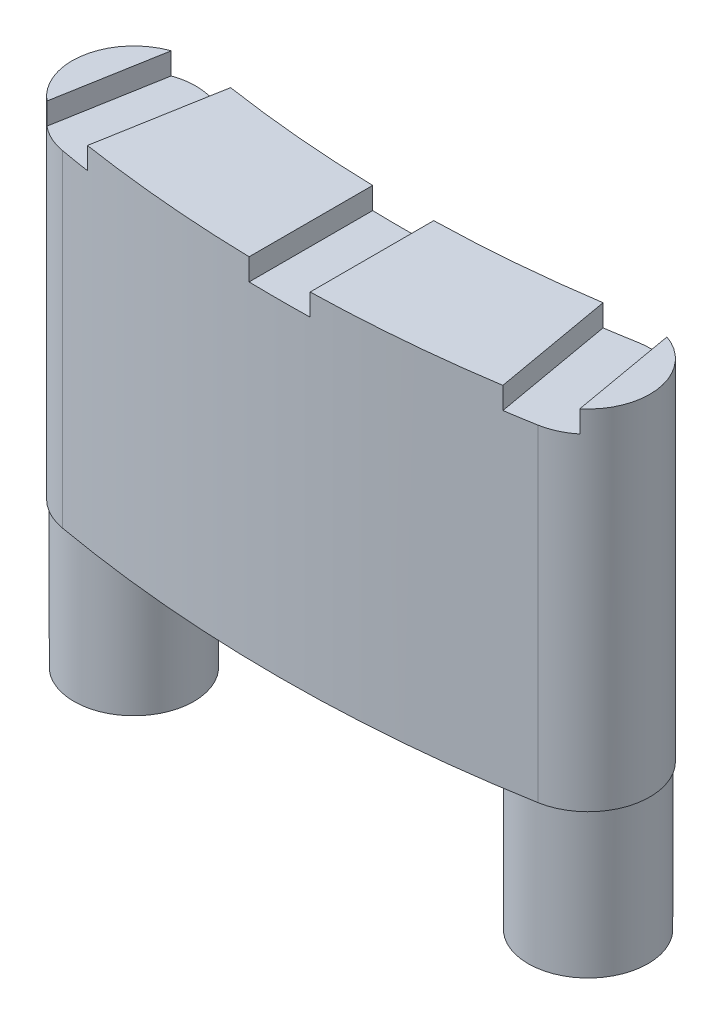
ISO-10303-21;
HEADER;
FILE_DESCRIPTION(('STEP AP214'),'2;1');
FILE_NAME('part.step','',(''),(''),'','','');
FILE_SCHEMA(('AUTOMOTIVE_DESIGN { 1 0 10303 214 1 1 1 1 }'));
ENDSEC;
DATA;
#1=APPLICATION_CONTEXT('core data for automotive mechanical design processes');
#2=APPLICATION_PROTOCOL_DEFINITION('international standard','automotive_design',2000,#1);
#3=PRODUCT_CONTEXT('',#1,'mechanical');
#4=PRODUCT('Part','Part','',(#3));
#5=PRODUCT_RELATED_PRODUCT_CATEGORY('part','',(#4));
#6=PRODUCT_DEFINITION_FORMATION('','',#4);
#7=PRODUCT_DEFINITION_CONTEXT('part definition',#1,'design');
#8=PRODUCT_DEFINITION('design','',#6,#7);
#9=PRODUCT_DEFINITION_SHAPE('','',#8);
#10=(LENGTH_UNIT() NAMED_UNIT(*) SI_UNIT(.MILLI.,.METRE.));
#11=(NAMED_UNIT(*) PLANE_ANGLE_UNIT() SI_UNIT($,.RADIAN.));
#12=(NAMED_UNIT(*) SI_UNIT($,.STERADIAN.) SOLID_ANGLE_UNIT());
#13=UNCERTAINTY_MEASURE_WITH_UNIT(LENGTH_MEASURE(1.E-05),#10,'distance_accuracy_value','');
#14=(GEOMETRIC_REPRESENTATION_CONTEXT(3) GLOBAL_UNCERTAINTY_ASSIGNED_CONTEXT((#13)) GLOBAL_UNIT_ASSIGNED_CONTEXT((#10,
#11,#12)) REPRESENTATION_CONTEXT('',''));
#15=CARTESIAN_POINT('',(0.,0.,0.));
#16=DIRECTION('',(0.,0.,1.));
#17=DIRECTION('',(1.,0.,0.));
#18=AXIS2_PLACEMENT_3D('',#15,#16,#17);
#19=CARTESIAN_POINT('',(-7.80892658931664,24.,-47.5042222803918));
#20=DIRECTION('',(0.,1.,0.));
#21=DIRECTION('',(0.,0.,1.));
#22=AXIS2_PLACEMENT_3D('',#19,#20,#21);
#23=PLANE('',#22);
#24=DIRECTION('',(-0.17364817766693,0.,-0.984807753012208));
#25=VECTOR('',#24,1.);
#26=CARTESIAN_POINT('',(9.41109191254966,24.,-50.5405761505698));
#27=LINE('',#26,#25);
#28=CARTESIAN_POINT('',(18.3386484929561,24.,0.0901131774980607));
#29=VERTEX_POINT('',#28);
#30=CARTESIAN_POINT('',(17.0543750947054,24.,-7.19336319741984));
#31=VERTEX_POINT('',#30);
#32=EDGE_CURVE('E258',#29,#31,#27,.T.);
#33=ORIENTED_EDGE('',*,*,#32,.F.);
#34=CARTESIAN_POINT('',(15.6335772894344,24.,-3.18787399740136));
#35=DIRECTION('',(0.,1.,0.));
#36=DIRECTION('',(0.,0.,-1.));
#37=AXIS2_PLACEMENT_3D('',#34,#35,#36);
#38=CIRCLE('',#37,4.25001295703056);
#39=EDGE_CURVE('E211',#29,#31,#38,.T.);
#40=ORIENTED_EDGE('',*,*,#39,.T.);
#41=EDGE_LOOP('',(#33,#40));
#42=FACE_BOUND('',#41,.T.);
#43=ADVANCED_FACE('F33',(#42),#23,.T.);
#44=DIRECTION('',(0.173648177666932,0.,-0.984807753012208));
#45=VECTOR('',#44,1.);
#46=CARTESIAN_POINT('',(-5.74599208495633,24.,-47.1404712678386));
#47=LINE('',#46,#45);
#48=CARTESIAN_POINT('',(-14.2941220515957,24.,1.33838280369231));
#49=VERTEX_POINT('',#48);
#50=CARTESIAN_POINT('',(-12.8177116848135,24.,-7.03475646773465));
#51=VERTEX_POINT('',#50);
#52=EDGE_CURVE('E272',#49,#51,#47,.T.);
#53=ORIENTED_EDGE('',*,*,#52,.F.);
#54=CARTESIAN_POINT('',(0.00524140569490179,24.,-91.8205711659412));
#55=DIRECTION('',(0.,1.,0.));
#56=DIRECTION('',(0.,0.,1.));
#57=AXIS2_PLACEMENT_3D('',#54,#55,#56);
#58=CIRCLE('',#57,94.25);
#59=CARTESIAN_POINT('',(-2.1,24.,2.40591374474483));
#60=VERTEX_POINT('',#59);
#61=EDGE_CURVE('E209',#49,#60,#58,.T.);
#62=ORIENTED_EDGE('',*,*,#61,.T.);
#63=DIRECTION('',(0.,0.,1.));
#64=VECTOR('',#63,1.);
#65=CARTESIAN_POINT('',(-2.09999999999996,24.,-47.5042222803918));
#66=LINE('',#65,#64);
#67=CARTESIAN_POINT('',(-2.1,24.,-6.09641786814687));
#68=VERTEX_POINT('',#67);
#69=EDGE_CURVE('E239',#68,#60,#66,.T.);
#70=ORIENTED_EDGE('',*,*,#69,.F.);
#71=CARTESIAN_POINT('',(0.00524140569490179,24.,-91.8205711659412));
#72=DIRECTION('',(0.,-1.,0.));
#73=DIRECTION('',(0.,0.,1.));
#74=AXIS2_PLACEMENT_3D('',#71,#72,#73);
#75=CIRCLE('',#74,85.75);
#76=EDGE_CURVE('E214',#68,#51,#75,.T.);
#77=ORIENTED_EDGE('',*,*,#76,.T.);
#78=EDGE_LOOP('',(#53,#62,#70,#77));
#79=FACE_BOUND('',#78,.T.);
#80=ADVANCED_FACE('F325',(#79),#23,.T.);
#81=DIRECTION('',(0.17364817766693,0.,0.984807753012208));
#82=VECTOR('',#81,1.);
#83=CARTESIAN_POINT('',(5.27489934989838,24.,-49.8112538043687));
#84=LINE('',#83,#82);
#85=CARTESIAN_POINT('',(12.8178263496068,24.,-7.03318904421842));
#86=VERTEX_POINT('',#85);
#87=CARTESIAN_POINT('',(14.2942407401054,24.,1.33997304683814));
#88=VERTEX_POINT('',#87);
#89=EDGE_CURVE('E161',#86,#88,#84,.T.);
#90=ORIENTED_EDGE('',*,*,#89,.F.);
#91=CARTESIAN_POINT('',(2.1,24.,-6.09616106921566));
#92=VERTEX_POINT('',#91);
#93=EDGE_CURVE('E215',#86,#92,#75,.T.);
#94=ORIENTED_EDGE('',*,*,#93,.T.);
#95=DIRECTION('',(0.,0.,-1.));
#96=VECTOR('',#95,1.);
#97=CARTESIAN_POINT('',(2.10000000000004,24.,-47.5042222803918));
#98=LINE('',#97,#96);
#99=CARTESIAN_POINT('',(2.1,24.,2.4061473720169));
#100=VERTEX_POINT('',#99);
#101=EDGE_CURVE('E171',#100,#92,#98,.T.);
#102=ORIENTED_EDGE('',*,*,#101,.F.);
#103=EDGE_CURVE('E207',#100,#88,#58,.T.);
#104=ORIENTED_EDGE('',*,*,#103,.T.);
#105=EDGE_LOOP('',(#90,#94,#102,#104));
#106=FACE_BOUND('',#105,.T.);
#107=ADVANCED_FACE('F306',(#106),#23,.T.);
#108=CARTESIAN_POINT('',(-15.6230945843282,24.,-3.18787339484238));
#109=DIRECTION('',(0.,-1.,0.));
#110=DIRECTION('',(0.,0.,-1.));
#111=AXIS2_PLACEMENT_3D('',#108,#109,#110);
#112=CYLINDRICAL_SURFACE('',#111,4.25);
#113=CARTESIAN_POINT('',(-15.6230945843282,24.,-3.18787339484238));
#114=DIRECTION('',(0.,1.,0.));
#115=DIRECTION('',(0.,0.,1.));
#116=AXIS2_PLACEMENT_3D('',#113,#114,#115);
#117=CIRCLE('',#116,4.25);
#118=CARTESIAN_POINT('',(-17.0552531039034,24.,-7.18930088697669));
#119=VERTEX_POINT('',#118);
#120=CARTESIAN_POINT('',(-18.3374521813357,24.,0.0824114299959114));
#121=VERTEX_POINT('',#120);
#122=EDGE_CURVE('E204',#119,#121,#117,.T.);
#123=ORIENTED_EDGE('',*,*,#122,.F.);
#124=DIRECTION('',(0.,-1.,0.));
#125=VECTOR('',#124,1.);
#126=CARTESIAN_POINT('',(-17.0552531039034,24.,-7.18930088697669));
#127=LINE('',#126,#125);
#128=CARTESIAN_POINT('',(-17.0552531039034,22.5,-7.18930088697669));
#129=VERTEX_POINT('',#128);
#130=EDGE_CURVE('E56',#119,#129,#127,.T.);
#131=ORIENTED_EDGE('',*,*,#130,.T.);
#132=CARTESIAN_POINT('',(-15.6230945843282,22.5,-3.18787339484238));
#133=DIRECTION('',(0.,1.,0.));
#134=DIRECTION('',(0.,0.,1.));
#135=AXIS2_PLACEMENT_3D('',#132,#133,#134);
#136=CIRCLE('',#135,4.25);
#137=CARTESIAN_POINT('',(-14.8850898292438,22.5,-7.37330634514428));
#138=VERTEX_POINT('',#137);
#139=EDGE_CURVE('E280',#138,#129,#136,.T.);
#140=ORIENTED_EDGE('',*,*,#139,.F.);
#141=DIRECTION('',(0.,-1.,0.));
#142=VECTOR('',#141,1.);
#143=CARTESIAN_POINT('',(-14.8850898292438,24.,-7.37330634514428));
#144=LINE('',#143,#142);
#145=CARTESIAN_POINT('',(-14.8850898292438,0.,-7.37330634514428));
#146=VERTEX_POINT('',#145);
#147=EDGE_CURVE('E217',#138,#146,#144,.T.);
#148=ORIENTED_EDGE('',*,*,#147,.T.);
#149=CARTESIAN_POINT('',(-15.6230945843282,0.,-3.18787339484238));
#150=DIRECTION('',(0.,1.,0.));
#151=DIRECTION('',(0.,0.,1.));
#152=AXIS2_PLACEMENT_3D('',#149,#150,#151);
#153=CIRCLE('',#152,4.25);
#154=CARTESIAN_POINT('',(-16.3610993394126,0.,0.997559555459479));
#155=VERTEX_POINT('',#154);
#156=EDGE_CURVE('E203',#146,#155,#153,.T.);
#157=ORIENTED_EDGE('',*,*,#156,.T.);
#158=DIRECTION('',(0.,-1.,0.));
#159=VECTOR('',#158,1.);
#160=CARTESIAN_POINT('',(-16.3610993394126,24.,0.997559555459479));
#161=LINE('',#160,#159);
#162=CARTESIAN_POINT('',(-16.3610993394126,22.5,0.997559555459493));
#163=VERTEX_POINT('',#162);
#164=EDGE_CURVE('E231',#163,#155,#161,.T.);
#165=ORIENTED_EDGE('',*,*,#164,.F.);
#166=CARTESIAN_POINT('',(-18.3374521813357,22.5,0.0824114299959114));
#167=VERTEX_POINT('',#166);
#168=EDGE_CURVE('E282',#167,#163,#136,.T.);
#169=ORIENTED_EDGE('',*,*,#168,.F.);
#170=DIRECTION('',(0.,-1.,0.));
#171=VECTOR('',#170,1.);
#172=CARTESIAN_POINT('',(-18.3374521813357,24.,0.0824114299959118));
#173=LINE('',#172,#171);
#174=EDGE_CURVE('E165',#167,#121,#173,.F.);
#175=ORIENTED_EDGE('',*,*,#174,.T.);
#176=EDGE_LOOP('',(#123,#131,#140,#148,#157,#165,#169,#175));
#177=FACE_BOUND('',#176,.T.);
#178=ADVANCED_FACE('F35',(#177),#112,.T.);
#179=CARTESIAN_POINT('',(0.00524140569490179,24.,-91.8205711659412));
#180=DIRECTION('',(0.,-1.,0.));
#181=DIRECTION('',(0.,0.,-1.));
#182=AXIS2_PLACEMENT_3D('',#179,#180,#181);
#183=CYLINDRICAL_SURFACE('',#182,94.25);
#184=CARTESIAN_POINT('',(0.00524140569490179,22.5,-91.8205711659412));
#185=DIRECTION('',(0.,1.,0.));
#186=DIRECTION('',(0.,0.,1.));
#187=AXIS2_PLACEMENT_3D('',#184,#185,#186);
#188=CIRCLE('',#187,94.25);
#189=CARTESIAN_POINT('',(14.2942407401054,22.5,1.33997304683814));
#190=VERTEX_POINT('',#189);
#191=CARTESIAN_POINT('',(16.3612584956571,22.5,0.999379302440653));
#192=VERTEX_POINT('',#191);
#193=EDGE_CURVE('E150',#190,#192,#188,.T.);
#194=ORIENTED_EDGE('',*,*,#193,.F.);
#195=DIRECTION('',(0.,1.,0.));
#196=VECTOR('',#195,1.);
#197=CARTESIAN_POINT('',(14.2942407401054,22.5,1.33997304683814));
#198=LINE('',#197,#196);
#199=EDGE_CURVE('E155',#190,#88,#198,.T.);
#200=ORIENTED_EDGE('',*,*,#199,.T.);
#201=ORIENTED_EDGE('',*,*,#103,.F.);
#202=DIRECTION('',(0.,1.,0.));
#203=VECTOR('',#202,1.);
#204=CARTESIAN_POINT('',(2.1,22.5,2.4061473720169));
#205=LINE('',#204,#203);
#206=CARTESIAN_POINT('',(2.1,22.5,2.4061473720169));
#207=VERTEX_POINT('',#206);
#208=EDGE_CURVE('E187',#207,#100,#205,.T.);
#209=ORIENTED_EDGE('',*,*,#208,.F.);
#210=CARTESIAN_POINT('',(0.00524140569490179,22.5,-91.8205711659412));
#211=DIRECTION('',(0.,1.,0.));
#212=DIRECTION('',(0.,0.,1.));
#213=AXIS2_PLACEMENT_3D('',#210,#211,#212);
#214=CIRCLE('',#213,94.25);
#215=CARTESIAN_POINT('',(-2.1,22.5,2.40591374474483));
#216=VERTEX_POINT('',#215);
#217=EDGE_CURVE('E195',#216,#207,#214,.T.);
#218=ORIENTED_EDGE('',*,*,#217,.F.);
#219=DIRECTION('',(0.,1.,0.));
#220=VECTOR('',#219,1.);
#221=CARTESIAN_POINT('',(-2.1,22.5,2.40591374474483));
#222=LINE('',#221,#220);
#223=EDGE_CURVE('E183',#216,#60,#222,.T.);
#224=ORIENTED_EDGE('',*,*,#223,.T.);
#225=ORIENTED_EDGE('',*,*,#61,.F.);
#226=DIRECTION('',(0.,1.,0.));
#227=VECTOR('',#226,1.);
#228=CARTESIAN_POINT('',(-14.2941220515957,22.5,1.33838280369231));
#229=LINE('',#228,#227);
#230=CARTESIAN_POINT('',(-14.2941220515957,22.5,1.33838280369231));
#231=VERTEX_POINT('',#230);
#232=EDGE_CURVE('E264',#231,#49,#229,.T.);
#233=ORIENTED_EDGE('',*,*,#232,.F.);
#234=CARTESIAN_POINT('',(0.00524140569490179,22.5,-91.8205711659412));
#235=DIRECTION('',(0.,1.,0.));
#236=DIRECTION('',(0.,0.,1.));
#237=AXIS2_PLACEMENT_3D('',#234,#235,#236);
#238=CIRCLE('',#237,94.25);
#239=EDGE_CURVE('E281',#163,#231,#238,.T.);
#240=ORIENTED_EDGE('',*,*,#239,.F.);
#241=ORIENTED_EDGE('',*,*,#164,.T.);
#242=CARTESIAN_POINT('',(0.00524140569490179,0.,-91.8205711659412));
#243=DIRECTION('',(0.,1.,0.));
#244=DIRECTION('',(0.,0.,1.));
#245=AXIS2_PLACEMENT_3D('',#242,#243,#244);
#246=CIRCLE('',#245,94.25);
#247=CARTESIAN_POINT('',(16.3612584956571,0.,0.999379302440653));
#248=VERTEX_POINT('',#247);
#249=EDGE_CURVE('E220',#155,#248,#246,.T.);
#250=ORIENTED_EDGE('',*,*,#249,.T.);
#251=DIRECTION('',(0.,-1.,0.));
#252=VECTOR('',#251,1.);
#253=CARTESIAN_POINT('',(16.3612584956571,24.,0.999379302440653));
#254=LINE('',#253,#252);
#255=EDGE_CURVE('E170',#192,#248,#254,.T.);
#256=ORIENTED_EDGE('',*,*,#255,.F.);
#257=EDGE_LOOP('',(#194,#200,#201,#209,#218,#224,#225,#233,#240,#241,#250,#256));
#258=FACE_BOUND('',#257,.T.);
#259=ADVANCED_FACE('F168',(#258),#183,.T.);
#260=CARTESIAN_POINT('',(15.6335772894344,24.,-3.18787399740136));
#261=DIRECTION('',(0.,-1.,0.));
#262=DIRECTION('',(0.,0.,-1.));
#263=AXIS2_PLACEMENT_3D('',#260,#261,#262);
#264=CYLINDRICAL_SURFACE('',#263,4.25001295703056);
#265=CARTESIAN_POINT('',(15.6335772894344,22.5,-3.18787399740136));
#266=DIRECTION('',(0.,1.,0.));
#267=DIRECTION('',(0.,0.,1.));
#268=AXIS2_PLACEMENT_3D('',#265,#266,#267);
#269=CIRCLE('',#268,4.25001295703056);
#270=CARTESIAN_POINT('',(17.0543750947054,22.5,-7.19336319741984));
#271=VERTEX_POINT('',#270);
#272=CARTESIAN_POINT('',(14.885248975457,22.5,-7.37148665507266));
#273=VERTEX_POINT('',#272);
#274=EDGE_CURVE('E48',#271,#273,#269,.T.);
#275=ORIENTED_EDGE('',*,*,#274,.F.);
#276=DIRECTION('',(0.,-1.,0.));
#277=VECTOR('',#276,1.);
#278=CARTESIAN_POINT('',(17.0543750947054,24.,-7.19336319741984));
#279=LINE('',#278,#277);
#280=EDGE_CURVE('E11',#271,#31,#279,.F.);
#281=ORIENTED_EDGE('',*,*,#280,.T.);
#282=ORIENTED_EDGE('',*,*,#39,.F.);
#283=DIRECTION('',(0.,-1.,0.));
#284=VECTOR('',#283,1.);
#285=CARTESIAN_POINT('',(18.3386484929561,24.,0.0901131774980633));
#286=LINE('',#285,#284);
#287=CARTESIAN_POINT('',(18.3386484929561,22.5,0.0901131774980607));
#288=VERTEX_POINT('',#287);
#289=EDGE_CURVE('E41',#29,#288,#286,.T.);
#290=ORIENTED_EDGE('',*,*,#289,.T.);
#291=EDGE_CURVE('E172',#192,#288,#269,.T.);
#292=ORIENTED_EDGE('',*,*,#291,.F.);
#293=ORIENTED_EDGE('',*,*,#255,.T.);
#294=CARTESIAN_POINT('',(15.6335772894344,0.,-3.18787399740136));
#295=DIRECTION('',(0.,1.,0.));
#296=DIRECTION('',(0.,0.,-1.));
#297=AXIS2_PLACEMENT_3D('',#294,#295,#296);
#298=CIRCLE('',#297,4.25001295703056);
#299=CARTESIAN_POINT('',(14.885248975457,0.,-7.37148665507266));
#300=VERTEX_POINT('',#299);
#301=EDGE_CURVE('E222',#248,#300,#298,.T.);
#302=ORIENTED_EDGE('',*,*,#301,.T.);
#303=DIRECTION('',(0.,-1.,0.));
#304=VECTOR('',#303,1.);
#305=CARTESIAN_POINT('',(14.885248975457,24.,-7.37148665507266));
#306=LINE('',#305,#304);
#307=EDGE_CURVE('E228',#273,#300,#306,.T.);
#308=ORIENTED_EDGE('',*,*,#307,.F.);
#309=EDGE_LOOP('',(#275,#281,#282,#290,#292,#293,#302,#308));
#310=FACE_BOUND('',#309,.T.);
#311=ADVANCED_FACE('F253',(#310),#264,.T.);
#312=CARTESIAN_POINT('',(0.00524140569490179,24.,-91.8205711659412));
#313=DIRECTION('',(0.,-1.,0.));
#314=DIRECTION('',(0.,0.,-1.));
#315=AXIS2_PLACEMENT_3D('',#312,#313,#314);
#316=CYLINDRICAL_SURFACE('',#315,85.75);
#317=ORIENTED_EDGE('',*,*,#93,.F.);
#318=DIRECTION('',(0.,-1.,0.));
#319=VECTOR('',#318,1.);
#320=CARTESIAN_POINT('',(12.8178263496068,24.,-7.03318904421843));
#321=LINE('',#320,#319);
#322=CARTESIAN_POINT('',(12.8178263496068,22.5,-7.03318904421842));
#323=VERTEX_POINT('',#322);
#324=EDGE_CURVE('E249',#86,#323,#321,.T.);
#325=ORIENTED_EDGE('',*,*,#324,.T.);
#326=CARTESIAN_POINT('',(0.00524140569490179,22.5,-91.8205711659412));
#327=DIRECTION('',(0.,1.,0.));
#328=DIRECTION('',(0.,0.,1.));
#329=AXIS2_PLACEMENT_3D('',#326,#327,#328);
#330=CIRCLE('',#329,85.75);
#331=EDGE_CURVE('E152',#273,#323,#330,.F.);
#332=ORIENTED_EDGE('',*,*,#331,.F.);
#333=ORIENTED_EDGE('',*,*,#307,.T.);
#334=CARTESIAN_POINT('',(0.00524140569490179,0.,-91.8205711659412));
#335=DIRECTION('',(0.,-1.,0.));
#336=DIRECTION('',(0.,0.,1.));
#337=AXIS2_PLACEMENT_3D('',#334,#335,#336);
#338=CIRCLE('',#337,85.75);
#339=EDGE_CURVE('E208',#300,#146,#338,.T.);
#340=ORIENTED_EDGE('',*,*,#339,.T.);
#341=ORIENTED_EDGE('',*,*,#147,.F.);
#342=CARTESIAN_POINT('',(0.00524140569490179,22.5,-91.8205711659412));
#343=DIRECTION('',(0.,1.,0.));
#344=DIRECTION('',(0.,0.,1.));
#345=AXIS2_PLACEMENT_3D('',#342,#343,#344);
#346=CIRCLE('',#345,85.75);
#347=CARTESIAN_POINT('',(-12.8177116848135,22.5,-7.03475646773465));
#348=VERTEX_POINT('',#347);
#349=EDGE_CURVE('E246',#348,#138,#346,.F.);
#350=ORIENTED_EDGE('',*,*,#349,.F.);
#351=DIRECTION('',(0.,1.,0.));
#352=VECTOR('',#351,1.);
#353=CARTESIAN_POINT('',(-12.8177116848135,22.5,-7.03475646773465));
#354=LINE('',#353,#352);
#355=EDGE_CURVE('E260',#348,#51,#354,.T.);
#356=ORIENTED_EDGE('',*,*,#355,.T.);
#357=ORIENTED_EDGE('',*,*,#76,.F.);
#358=DIRECTION('',(0.,-1.,0.));
#359=VECTOR('',#358,1.);
#360=CARTESIAN_POINT('',(-2.1,24.,-6.09641786814687));
#361=LINE('',#360,#359);
#362=CARTESIAN_POINT('',(-2.1,22.5,-6.09641786814687));
#363=VERTEX_POINT('',#362);
#364=EDGE_CURVE('E192',#68,#363,#361,.T.);
#365=ORIENTED_EDGE('',*,*,#364,.T.);
#366=CARTESIAN_POINT('',(0.00524140569490179,22.5,-91.8205711659412));
#367=DIRECTION('',(0.,1.,0.));
#368=DIRECTION('',(0.,0.,1.));
#369=AXIS2_PLACEMENT_3D('',#366,#367,#368);
#370=CIRCLE('',#369,85.75);
#371=CARTESIAN_POINT('',(2.1,22.5,-6.09616106921566));
#372=VERTEX_POINT('',#371);
#373=EDGE_CURVE('E242',#372,#363,#370,.F.);
#374=ORIENTED_EDGE('',*,*,#373,.F.);
#375=DIRECTION('',(0.,1.,0.));
#376=VECTOR('',#375,1.);
#377=CARTESIAN_POINT('',(2.1,22.5,-6.09616106921566));
#378=LINE('',#377,#376);
#379=EDGE_CURVE('E189',#372,#92,#378,.T.);
#380=ORIENTED_EDGE('',*,*,#379,.T.);
#381=EDGE_LOOP('',(#317,#325,#332,#333,#340,#341,#350,#356,#357,#365,#374,#380));
#382=FACE_BOUND('',#381,.T.);
#383=ADVANCED_FACE('F304',(#382),#316,.F.);
#384=DIRECTION('',(-0.173648177666931,0.,0.984807753012208));
#385=VECTOR('',#384,1.);
#386=CARTESIAN_POINT('',(-9.88218464760761,24.,-47.8697936140398));
#387=LINE('',#386,#385);
#388=EDGE_CURVE('E244',#119,#121,#387,.T.);
#389=ORIENTED_EDGE('',*,*,#388,.F.);
#390=ORIENTED_EDGE('',*,*,#122,.T.);
#391=EDGE_LOOP('',(#389,#390));
#392=FACE_BOUND('',#391,.T.);
#393=ADVANCED_FACE('F330',(#392),#23,.T.);
#394=CARTESIAN_POINT('',(-7.80892658931664,0.,-47.5042222803918));
#395=DIRECTION('',(0.,1.,0.));
#396=DIRECTION('',(0.,0.,1.));
#397=AXIS2_PLACEMENT_3D('',#394,#395,#396);
#398=PLANE('',#397);
#399=CARTESIAN_POINT('',(15.6335772894344,0.,-3.18787399740136));
#400=DIRECTION('',(0.,1.,0.));
#401=DIRECTION('',(0.,0.,1.));
#402=AXIS2_PLACEMENT_3D('',#399,#400,#401);
#403=CIRCLE('',#402,4.125);
#404=CARTESIAN_POINT('',(15.6335772894344,0.,0.937126002598635));
#405=VERTEX_POINT('',#404);
#406=EDGE_CURVE('E236',#405,#405,#403,.F.);
#407=ORIENTED_EDGE('',*,*,#406,.F.);
#408=EDGE_LOOP('',(#407));
#409=FACE_BOUND('',#408,.T.);
#410=CARTESIAN_POINT('',(-15.6230945843282,0.,-3.18787339484238));
#411=DIRECTION('',(0.,1.,0.));
#412=DIRECTION('',(0.,0.,1.));
#413=AXIS2_PLACEMENT_3D('',#410,#411,#412);
#414=CIRCLE('',#413,4.125);
#415=CARTESIAN_POINT('',(-15.6230945843282,0.,0.937126605157621));
#416=VERTEX_POINT('',#415);
#417=EDGE_CURVE('E233',#416,#416,#414,.F.);
#418=ORIENTED_EDGE('',*,*,#417,.F.);
#419=EDGE_LOOP('',(#418));
#420=FACE_BOUND('',#419,.T.);
#421=ORIENTED_EDGE('',*,*,#156,.F.);
#422=ORIENTED_EDGE('',*,*,#339,.F.);
#423=ORIENTED_EDGE('',*,*,#301,.F.);
#424=ORIENTED_EDGE('',*,*,#249,.F.);
#425=EDGE_LOOP('',(#421,#422,#423,#424));
#426=FACE_BOUND('',#425,.T.);
#427=ADVANCED_FACE('F299',(#409,#420,#426),#398,.F.);
#428=CARTESIAN_POINT('',(-15.6230945843282,-10.,-3.18787339484238));
#429=DIRECTION('',(0.,1.,0.));
#430=DIRECTION('',(0.,0.,1.));
#431=AXIS2_PLACEMENT_3D('',#428,#429,#430);
#432=CYLINDRICAL_SURFACE('',#431,4.125);
#433=CARTESIAN_POINT('',(-15.6230945843282,-10.,-3.18787339484238));
#434=DIRECTION('',(0.,-1.,0.));
#435=DIRECTION('',(0.,0.,-1.));
#436=AXIS2_PLACEMENT_3D('',#433,#434,#435);
#437=CIRCLE('',#436,4.125);
#438=CARTESIAN_POINT('',(-15.6230945843282,-10.,-7.31287339484238));
#439=VERTEX_POINT('',#438);
#440=EDGE_CURVE('E200',#439,#439,#437,.T.);
#441=ORIENTED_EDGE('',*,*,#440,.F.);
#442=EDGE_LOOP('',(#441));
#443=FACE_BOUND('',#442,.T.);
#444=ORIENTED_EDGE('',*,*,#417,.T.);
#445=EDGE_LOOP('',(#444));
#446=FACE_BOUND('',#445,.T.);
#447=ADVANCED_FACE('F352',(#443,#446),#432,.T.);
#448=CARTESIAN_POINT('',(-15.6230945843282,-10.,-3.18787339484238));
#449=DIRECTION('',(0.,-1.,0.));
#450=DIRECTION('',(0.,0.,-1.));
#451=AXIS2_PLACEMENT_3D('',#448,#449,#450);
#452=PLANE('',#451);
#453=ORIENTED_EDGE('',*,*,#440,.T.);
#454=EDGE_LOOP('',(#453));
#455=FACE_BOUND('',#454,.T.);
#456=ADVANCED_FACE('F453',(#455),#452,.T.);
#457=CARTESIAN_POINT('',(15.6335772894344,-10.,-3.18787399740136));
#458=DIRECTION('',(0.,1.,0.));
#459=DIRECTION('',(0.,0.,1.));
#460=AXIS2_PLACEMENT_3D('',#457,#458,#459);
#461=CYLINDRICAL_SURFACE('',#460,4.125);
#462=CARTESIAN_POINT('',(15.6335772894344,-10.,-3.18787399740136));
#463=DIRECTION('',(0.,-1.,0.));
#464=DIRECTION('',(0.,0.,-1.));
#465=AXIS2_PLACEMENT_3D('',#462,#463,#464);
#466=CIRCLE('',#465,4.125);
#467=CARTESIAN_POINT('',(15.6335772894344,-10.,-7.31287399740136));
#468=VERTEX_POINT('',#467);
#469=EDGE_CURVE('E197',#468,#468,#466,.T.);
#470=ORIENTED_EDGE('',*,*,#469,.F.);
#471=EDGE_LOOP('',(#470));
#472=FACE_BOUND('',#471,.T.);
#473=ORIENTED_EDGE('',*,*,#406,.T.);
#474=EDGE_LOOP('',(#473));
#475=FACE_BOUND('',#474,.T.);
#476=ADVANCED_FACE('F445',(#472,#475),#461,.T.);
#477=CARTESIAN_POINT('',(15.6335772894344,-10.,-3.18787399740136));
#478=DIRECTION('',(0.,-1.,0.));
#479=DIRECTION('',(0.,0.,-1.));
#480=AXIS2_PLACEMENT_3D('',#477,#478,#479);
#481=PLANE('',#480);
#482=ORIENTED_EDGE('',*,*,#469,.T.);
#483=EDGE_LOOP('',(#482));
#484=FACE_BOUND('',#483,.T.);
#485=ADVANCED_FACE('F438',(#484),#481,.T.);
#486=CARTESIAN_POINT('',(0.634279700777776,22.5,-66.0782555975367));
#487=DIRECTION('',(0.,1.,0.));
#488=DIRECTION('',(0.,0.,1.));
#489=AXIS2_PLACEMENT_3D('',#486,#487,#488);
#490=PLANE('',#489);
#491=ORIENTED_EDGE('',*,*,#217,.T.);
#492=DIRECTION('',(0.,0.,-1.));
#493=VECTOR('',#492,1.);
#494=CARTESIAN_POINT('',(2.10000000000004,22.5,-47.5042222803918));
#495=LINE('',#494,#493);
#496=EDGE_CURVE('E175',#207,#372,#495,.T.);
#497=ORIENTED_EDGE('',*,*,#496,.T.);
#498=ORIENTED_EDGE('',*,*,#373,.T.);
#499=DIRECTION('',(0.,0.,1.));
#500=VECTOR('',#499,1.);
#501=CARTESIAN_POINT('',(-2.09999999999996,22.5,-47.5042222803918));
#502=LINE('',#501,#500);
#503=EDGE_CURVE('E182',#363,#216,#502,.T.);
#504=ORIENTED_EDGE('',*,*,#503,.T.);
#505=EDGE_LOOP('',(#491,#497,#498,#504));
#506=FACE_BOUND('',#505,.T.);
#507=ADVANCED_FACE('F315',(#506),#490,.T.);
#508=CARTESIAN_POINT('',(-2.09999999999996,22.5,-47.5042222803918));
#509=DIRECTION('',(-1.,0.,0.));
#510=DIRECTION('',(0.,0.,1.));
#511=AXIS2_PLACEMENT_3D('',#508,#509,#510);
#512=PLANE('',#511);
#513=ORIENTED_EDGE('',*,*,#69,.T.);
#514=ORIENTED_EDGE('',*,*,#223,.F.);
#515=ORIENTED_EDGE('',*,*,#503,.F.);
#516=ORIENTED_EDGE('',*,*,#364,.F.);
#517=EDGE_LOOP('',(#513,#514,#515,#516));
#518=FACE_BOUND('',#517,.T.);
#519=ADVANCED_FACE('F321',(#518),#512,.F.);
#520=CARTESIAN_POINT('',(2.10000000000004,22.5,-47.5042222803918));
#521=DIRECTION('',(1.,0.,0.));
#522=DIRECTION('',(0.,0.,-1.));
#523=AXIS2_PLACEMENT_3D('',#520,#521,#522);
#524=PLANE('',#523);
#525=ORIENTED_EDGE('',*,*,#101,.T.);
#526=ORIENTED_EDGE('',*,*,#379,.F.);
#527=ORIENTED_EDGE('',*,*,#496,.F.);
#528=ORIENTED_EDGE('',*,*,#208,.T.);
#529=EDGE_LOOP('',(#525,#526,#527,#528));
#530=FACE_BOUND('',#529,.T.);
#531=ADVANCED_FACE('F312',(#530),#524,.F.);
#532=CARTESIAN_POINT('',(-3.8453829917464,22.5,-66.3601078600658));
#533=DIRECTION('',(0.,1.,0.));
#534=DIRECTION('',(0.,0.,1.));
#535=AXIS2_PLACEMENT_3D('',#532,#533,#534);
#536=PLANE('',#535);
#537=ORIENTED_EDGE('',*,*,#168,.T.);
#538=ORIENTED_EDGE('',*,*,#239,.T.);
#539=DIRECTION('',(0.173648177666932,0.,-0.984807753012208));
#540=VECTOR('',#539,1.);
#541=CARTESIAN_POINT('',(-5.74599208495633,22.5,-47.1404712678386));
#542=LINE('',#541,#540);
#543=EDGE_CURVE('E268',#231,#348,#542,.T.);
#544=ORIENTED_EDGE('',*,*,#543,.T.);
#545=ORIENTED_EDGE('',*,*,#349,.T.);
#546=ORIENTED_EDGE('',*,*,#139,.T.);
#547=DIRECTION('',(-0.173648177666931,0.,0.984807753012208));
#548=VECTOR('',#547,1.);
#549=CARTESIAN_POINT('',(-9.88218464760761,22.5,-47.8697936140398));
#550=LINE('',#549,#548);
#551=EDGE_CURVE('E271',#129,#167,#550,.T.);
#552=ORIENTED_EDGE('',*,*,#551,.T.);
#553=EDGE_LOOP('',(#537,#538,#544,#545,#546,#552));
#554=FACE_BOUND('',#553,.T.);
#555=ADVANCED_FACE('F287',(#554),#536,.T.);
#556=CARTESIAN_POINT('',(-9.88218464760761,22.5,-47.8697936140398));
#557=DIRECTION('',(-0.984807753012208,0.,-0.173648177666931));
#558=DIRECTION('',(-0.173648177666931,0.,0.984807753012208));
#559=AXIS2_PLACEMENT_3D('',#556,#557,#558);
#560=PLANE('',#559);
#561=ORIENTED_EDGE('',*,*,#388,.T.);
#562=ORIENTED_EDGE('',*,*,#174,.F.);
#563=ORIENTED_EDGE('',*,*,#551,.F.);
#564=ORIENTED_EDGE('',*,*,#130,.F.);
#565=EDGE_LOOP('',(#561,#562,#563,#564));
#566=FACE_BOUND('',#565,.T.);
#567=ADVANCED_FACE('F331',(#566),#560,.F.);
#568=CARTESIAN_POINT('',(-5.74599208495633,22.5,-47.1404712678386));
#569=DIRECTION('',(0.984807753012208,0.,0.173648177666932));
#570=DIRECTION('',(0.173648177666932,0.,-0.984807753012208));
#571=AXIS2_PLACEMENT_3D('',#568,#569,#570);
#572=PLANE('',#571);
#573=ORIENTED_EDGE('',*,*,#52,.T.);
#574=ORIENTED_EDGE('',*,*,#355,.F.);
#575=ORIENTED_EDGE('',*,*,#543,.F.);
#576=ORIENTED_EDGE('',*,*,#232,.T.);
#577=EDGE_LOOP('',(#573,#574,#575,#576));
#578=FACE_BOUND('',#577,.T.);
#579=ADVANCED_FACE('F327',(#578),#572,.F.);
#580=CARTESIAN_POINT('',(9.41109191254966,22.5,-50.5405761505698));
#581=DIRECTION('',(0.984807753012208,0.,-0.17364817766693));
#582=DIRECTION('',(-0.17364817766693,0.,-0.984807753012208));
#583=AXIS2_PLACEMENT_3D('',#580,#581,#582);
#584=PLANE('',#583);
#585=ORIENTED_EDGE('',*,*,#32,.T.);
#586=ORIENTED_EDGE('',*,*,#280,.F.);
#587=DIRECTION('',(-0.17364817766693,0.,-0.984807753012208));
#588=VECTOR('',#587,1.);
#589=CARTESIAN_POINT('',(9.41109191254966,22.5,-50.5405761505698));
#590=LINE('',#589,#588);
#591=EDGE_CURVE('E156',#288,#271,#590,.T.);
#592=ORIENTED_EDGE('',*,*,#591,.F.);
#593=ORIENTED_EDGE('',*,*,#289,.F.);
#594=EDGE_LOOP('',(#585,#586,#592,#593));
#595=FACE_BOUND('',#594,.T.);
#596=ADVANCED_FACE('F257',(#595),#584,.F.);
#597=CARTESIAN_POINT('',(5.27489934989838,22.5,-49.8112538043687));
#598=DIRECTION('',(-0.984807753012208,0.,0.17364817766693));
#599=DIRECTION('',(0.17364817766693,0.,0.984807753012208));
#600=AXIS2_PLACEMENT_3D('',#597,#598,#599);
#601=PLANE('',#600);
#602=ORIENTED_EDGE('',*,*,#89,.T.);
#603=ORIENTED_EDGE('',*,*,#199,.F.);
#604=DIRECTION('',(0.17364817766693,0.,0.984807753012208));
#605=VECTOR('',#604,1.);
#606=CARTESIAN_POINT('',(5.27489934989838,22.5,-49.8112538043687));
#607=LINE('',#606,#605);
#608=EDGE_CURVE('E146',#323,#190,#607,.T.);
#609=ORIENTED_EDGE('',*,*,#608,.F.);
#610=ORIENTED_EDGE('',*,*,#324,.F.);
#611=EDGE_LOOP('',(#602,#603,#609,#610));
#612=FACE_BOUND('',#611,.T.);
#613=ADVANCED_FACE('F159',(#612),#601,.F.);
#614=CARTESIAN_POINT('',(5.0948293830146,22.5,-66.5785705673135));
#615=DIRECTION('',(0.,1.,0.));
#616=DIRECTION('',(0.,0.,1.));
#617=AXIS2_PLACEMENT_3D('',#614,#615,#616);
#618=PLANE('',#617);
#619=ORIENTED_EDGE('',*,*,#193,.T.);
#620=ORIENTED_EDGE('',*,*,#291,.T.);
#621=ORIENTED_EDGE('',*,*,#591,.T.);
#622=ORIENTED_EDGE('',*,*,#274,.T.);
#623=ORIENTED_EDGE('',*,*,#331,.T.);
#624=ORIENTED_EDGE('',*,*,#608,.T.);
#625=EDGE_LOOP('',(#619,#620,#621,#622,#623,#624));
#626=FACE_BOUND('',#625,.T.);
#627=ADVANCED_FACE('F148',(#626),#618,.T.);
#628=CLOSED_SHELL('',(#43,#80,#107,#178,#259,#311,#383,#393,#427,#447,#456,#476,#485,#507,#519,
#531,#555,#567,#579,#596,#613,#627));
#629=MANIFOLD_SOLID_BREP('B2',#628);
#630=ADVANCED_BREP_SHAPE_REPRESENTATION('',(#18,#629),#14);
#631=SHAPE_DEFINITION_REPRESENTATION(#9,#630);
ENDSEC;
END-ISO-10303-21;
